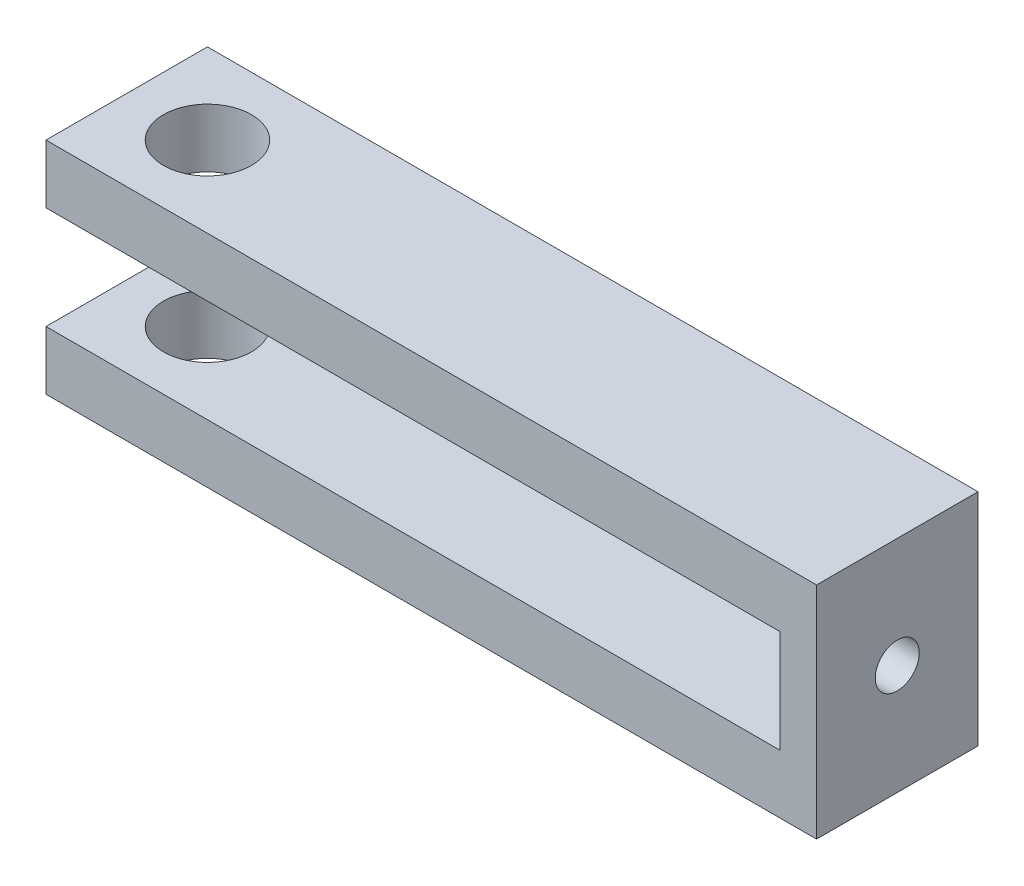
ISO-10303-21;
HEADER;
FILE_DESCRIPTION(('STEP AP214'),'2;1');
FILE_NAME('part.step','',(''),(''),'','','');
FILE_SCHEMA(('AUTOMOTIVE_DESIGN { 1 0 10303 214 1 1 1 1 }'));
ENDSEC;
DATA;
#1=APPLICATION_CONTEXT('core data for automotive mechanical design processes');
#2=APPLICATION_PROTOCOL_DEFINITION('international standard','automotive_design',2000,#1);
#3=PRODUCT_CONTEXT('',#1,'mechanical');
#4=PRODUCT('Part','Part','',(#3));
#5=PRODUCT_RELATED_PRODUCT_CATEGORY('part','',(#4));
#6=PRODUCT_DEFINITION_FORMATION('','',#4);
#7=PRODUCT_DEFINITION_CONTEXT('part definition',#1,'design');
#8=PRODUCT_DEFINITION('design','',#6,#7);
#9=PRODUCT_DEFINITION_SHAPE('','',#8);
#10=(LENGTH_UNIT() NAMED_UNIT(*) SI_UNIT(.MILLI.,.METRE.));
#11=(NAMED_UNIT(*) PLANE_ANGLE_UNIT() SI_UNIT($,.RADIAN.));
#12=(NAMED_UNIT(*) SI_UNIT($,.STERADIAN.) SOLID_ANGLE_UNIT());
#13=UNCERTAINTY_MEASURE_WITH_UNIT(LENGTH_MEASURE(1.E-05),#10,'distance_accuracy_value','');
#14=(GEOMETRIC_REPRESENTATION_CONTEXT(3) GLOBAL_UNCERTAINTY_ASSIGNED_CONTEXT((#13)) GLOBAL_UNIT_ASSIGNED_CONTEXT((#10,
#11,#12)) REPRESENTATION_CONTEXT('',''));
#15=CARTESIAN_POINT('',(0.,0.,0.));
#16=DIRECTION('',(0.,0.,1.));
#17=DIRECTION('',(1.,0.,0.));
#18=AXIS2_PLACEMENT_3D('',#15,#16,#17);
#19=CARTESIAN_POINT('',(0.,15.,22.));
#20=DIRECTION('',(0.,-1.,0.));
#21=DIRECTION('',(1.,0.,0.));
#22=AXIS2_PLACEMENT_3D('',#19,#20,#21);
#23=PLANE('',#22);
#24=CARTESIAN_POINT('',(-94.,15.,11.));
#25=DIRECTION('',(0.,-1.,0.));
#26=DIRECTION('',(0.,0.,-1.));
#27=AXIS2_PLACEMENT_3D('',#24,#25,#26);
#28=CIRCLE('',#27,6.);
#29=CARTESIAN_POINT('',(-94.,15.,5.));
#30=VERTEX_POINT('',#29);
#31=EDGE_CURVE('E183',#30,#30,#28,.T.);
#32=ORIENTED_EDGE('',*,*,#31,.T.);
#33=EDGE_LOOP('',(#32));
#34=FACE_BOUND('',#33,.T.);
#35=DIRECTION('',(-1.,0.,0.));
#36=VECTOR('',#35,1.);
#37=CARTESIAN_POINT('',(0.,15.,0.));
#38=LINE('',#37,#36);
#39=CARTESIAN_POINT('',(0.,15.,0.));
#40=VERTEX_POINT('',#39);
#41=CARTESIAN_POINT('',(-105.,15.,0.));
#42=VERTEX_POINT('',#41);
#43=EDGE_CURVE('E130',#40,#42,#38,.T.);
#44=ORIENTED_EDGE('',*,*,#43,.T.);
#45=DIRECTION('',(0.,0.,-1.));
#46=VECTOR('',#45,1.);
#47=CARTESIAN_POINT('',(-105.,15.,22.));
#48=LINE('',#47,#46);
#49=CARTESIAN_POINT('',(-105.,15.,22.));
#50=VERTEX_POINT('',#49);
#51=EDGE_CURVE('E11',#50,#42,#48,.T.);
#52=ORIENTED_EDGE('',*,*,#51,.F.);
#53=DIRECTION('',(-1.,0.,0.));
#54=VECTOR('',#53,1.);
#55=CARTESIAN_POINT('',(0.,15.,22.));
#56=LINE('',#55,#54);
#57=CARTESIAN_POINT('',(0.,15.,22.));
#58=VERTEX_POINT('',#57);
#59=EDGE_CURVE('E145',#58,#50,#56,.T.);
#60=ORIENTED_EDGE('',*,*,#59,.F.);
#61=DIRECTION('',(0.,0.,-1.));
#62=VECTOR('',#61,1.);
#63=CARTESIAN_POINT('',(0.,15.,22.));
#64=LINE('',#63,#62);
#65=EDGE_CURVE('E126',#58,#40,#64,.T.);
#66=ORIENTED_EDGE('',*,*,#65,.T.);
#67=EDGE_LOOP('',(#44,#52,#60,#66));
#68=FACE_BOUND('',#67,.T.);
#69=ADVANCED_FACE('F34',(#34,#68),#23,.F.);
#70=CARTESIAN_POINT('',(-105.,15.,22.));
#71=DIRECTION('',(1.,0.,0.));
#72=DIRECTION('',(0.,0.,-1.));
#73=AXIS2_PLACEMENT_3D('',#70,#71,#72);
#74=PLANE('',#73);
#75=DIRECTION('',(0.,-1.,0.));
#76=VECTOR('',#75,1.);
#77=CARTESIAN_POINT('',(-105.,15.,0.));
#78=LINE('',#77,#76);
#79=CARTESIAN_POINT('',(-105.,7.00000000000002,0.));
#80=VERTEX_POINT('',#79);
#81=EDGE_CURVE('E133',#42,#80,#78,.T.);
#82=ORIENTED_EDGE('',*,*,#81,.T.);
#83=DIRECTION('',(0.,0.,-1.));
#84=VECTOR('',#83,1.);
#85=CARTESIAN_POINT('',(-105.,7.00000000000002,22.));
#86=LINE('',#85,#84);
#87=CARTESIAN_POINT('',(-105.,7.00000000000002,22.));
#88=VERTEX_POINT('',#87);
#89=EDGE_CURVE('E42',#88,#80,#86,.T.);
#90=ORIENTED_EDGE('',*,*,#89,.F.);
#91=DIRECTION('',(0.,-1.,0.));
#92=VECTOR('',#91,1.);
#93=CARTESIAN_POINT('',(-105.,15.,22.));
#94=LINE('',#93,#92);
#95=EDGE_CURVE('E93',#50,#88,#94,.T.);
#96=ORIENTED_EDGE('',*,*,#95,.F.);
#97=ORIENTED_EDGE('',*,*,#51,.T.);
#98=EDGE_LOOP('',(#82,#90,#96,#97));
#99=FACE_BOUND('',#98,.T.);
#100=ADVANCED_FACE('F211',(#99),#74,.F.);
#101=CARTESIAN_POINT('',(-105.,7.00000000000002,22.));
#102=DIRECTION('',(0.,1.,0.));
#103=DIRECTION('',(-1.,0.,0.));
#104=AXIS2_PLACEMENT_3D('',#101,#102,#103);
#105=PLANE('',#104);
#106=CARTESIAN_POINT('',(-94.,7.00000000000001,11.));
#107=DIRECTION('',(0.,1.,0.));
#108=DIRECTION('',(-1.,0.,0.));
#109=AXIS2_PLACEMENT_3D('',#106,#107,#108);
#110=CIRCLE('',#109,6.);
#111=CARTESIAN_POINT('',(-100.,7.00000000000001,11.));
#112=VERTEX_POINT('',#111);
#113=EDGE_CURVE('E134',#112,#112,#110,.T.);
#114=ORIENTED_EDGE('',*,*,#113,.T.);
#115=EDGE_LOOP('',(#114));
#116=FACE_BOUND('',#115,.T.);
#117=DIRECTION('',(1.,0.,0.));
#118=VECTOR('',#117,1.);
#119=CARTESIAN_POINT('',(-105.,7.00000000000002,0.));
#120=LINE('',#119,#118);
#121=CARTESIAN_POINT('',(-4.99999999999999,7.,0.));
#122=VERTEX_POINT('',#121);
#123=EDGE_CURVE('E136',#80,#122,#120,.T.);
#124=ORIENTED_EDGE('',*,*,#123,.T.);
#125=DIRECTION('',(0.,0.,-1.));
#126=VECTOR('',#125,1.);
#127=CARTESIAN_POINT('',(-4.99999999999999,7.,22.));
#128=LINE('',#127,#126);
#129=CARTESIAN_POINT('',(-4.99999999999999,7.,22.));
#130=VERTEX_POINT('',#129);
#131=EDGE_CURVE('E152',#130,#122,#128,.T.);
#132=ORIENTED_EDGE('',*,*,#131,.F.);
#133=DIRECTION('',(1.,0.,0.));
#134=VECTOR('',#133,1.);
#135=CARTESIAN_POINT('',(-105.,7.00000000000002,22.));
#136=LINE('',#135,#134);
#137=EDGE_CURVE('E160',#88,#130,#136,.T.);
#138=ORIENTED_EDGE('',*,*,#137,.F.);
#139=ORIENTED_EDGE('',*,*,#89,.T.);
#140=EDGE_LOOP('',(#124,#132,#138,#139));
#141=FACE_BOUND('',#140,.T.);
#142=ADVANCED_FACE('F158',(#116,#141),#105,.F.);
#143=CARTESIAN_POINT('',(-4.99999999999999,7.,22.));
#144=DIRECTION('',(1.,0.,0.));
#145=DIRECTION('',(0.,1.,0.));
#146=AXIS2_PLACEMENT_3D('',#143,#144,#145);
#147=PLANE('',#146);
#148=CARTESIAN_POINT('',(-4.99999999999999,0.,11.));
#149=DIRECTION('',(1.,0.,0.));
#150=DIRECTION('',(0.,1.,0.));
#151=AXIS2_PLACEMENT_3D('',#148,#149,#150);
#152=CIRCLE('',#151,3.);
#153=CARTESIAN_POINT('',(-4.99999999999999,3.,11.));
#154=VERTEX_POINT('',#153);
#155=EDGE_CURVE('E187',#154,#154,#152,.T.);
#156=ORIENTED_EDGE('',*,*,#155,.T.);
#157=EDGE_LOOP('',(#156));
#158=FACE_BOUND('',#157,.T.);
#159=DIRECTION('',(0.,-1.,0.));
#160=VECTOR('',#159,1.);
#161=CARTESIAN_POINT('',(-4.99999999999999,7.,0.));
#162=LINE('',#161,#160);
#163=CARTESIAN_POINT('',(-4.99999999999999,-7.,0.));
#164=VERTEX_POINT('',#163);
#165=EDGE_CURVE('E138',#122,#164,#162,.T.);
#166=ORIENTED_EDGE('',*,*,#165,.T.);
#167=DIRECTION('',(0.,0.,-1.));
#168=VECTOR('',#167,1.);
#169=CARTESIAN_POINT('',(-4.99999999999999,-7.,22.));
#170=LINE('',#169,#168);
#171=CARTESIAN_POINT('',(-4.99999999999999,-7.,22.));
#172=VERTEX_POINT('',#171);
#173=EDGE_CURVE('E149',#172,#164,#170,.T.);
#174=ORIENTED_EDGE('',*,*,#173,.F.);
#175=DIRECTION('',(0.,-1.,0.));
#176=VECTOR('',#175,1.);
#177=CARTESIAN_POINT('',(-4.99999999999999,7.,22.));
#178=LINE('',#177,#176);
#179=EDGE_CURVE('E172',#130,#172,#178,.T.);
#180=ORIENTED_EDGE('',*,*,#179,.F.);
#181=ORIENTED_EDGE('',*,*,#131,.T.);
#182=EDGE_LOOP('',(#166,#174,#180,#181));
#183=FACE_BOUND('',#182,.T.);
#184=ADVANCED_FACE('F168',(#158,#183),#147,.F.);
#185=CARTESIAN_POINT('',(-4.99999999999999,-7.,22.));
#186=DIRECTION('',(0.,-1.,0.));
#187=DIRECTION('',(1.,0.,0.));
#188=AXIS2_PLACEMENT_3D('',#185,#186,#187);
#189=PLANE('',#188);
#190=CARTESIAN_POINT('',(-94.,-7.00000000000001,11.));
#191=DIRECTION('',(0.,-1.,0.));
#192=DIRECTION('',(1.,0.,0.));
#193=AXIS2_PLACEMENT_3D('',#190,#191,#192);
#194=CIRCLE('',#193,6.);
#195=CARTESIAN_POINT('',(-88.,-7.00000000000001,11.));
#196=VERTEX_POINT('',#195);
#197=EDGE_CURVE('E180',#196,#196,#194,.T.);
#198=ORIENTED_EDGE('',*,*,#197,.T.);
#199=EDGE_LOOP('',(#198));
#200=FACE_BOUND('',#199,.T.);
#201=DIRECTION('',(-1.,0.,0.));
#202=VECTOR('',#201,1.);
#203=CARTESIAN_POINT('',(-4.99999999999999,-7.,0.));
#204=LINE('',#203,#202);
#205=CARTESIAN_POINT('',(-105.,-7.00000000000001,0.));
#206=VERTEX_POINT('',#205);
#207=EDGE_CURVE('E140',#164,#206,#204,.T.);
#208=ORIENTED_EDGE('',*,*,#207,.T.);
#209=DIRECTION('',(0.,0.,-1.));
#210=VECTOR('',#209,1.);
#211=CARTESIAN_POINT('',(-105.,-7.00000000000001,22.));
#212=LINE('',#211,#210);
#213=CARTESIAN_POINT('',(-105.,-7.00000000000001,22.));
#214=VERTEX_POINT('',#213);
#215=EDGE_CURVE('E121',#214,#206,#212,.T.);
#216=ORIENTED_EDGE('',*,*,#215,.F.);
#217=DIRECTION('',(-1.,0.,0.));
#218=VECTOR('',#217,1.);
#219=CARTESIAN_POINT('',(-4.99999999999999,-7.,22.));
#220=LINE('',#219,#218);
#221=EDGE_CURVE('E112',#172,#214,#220,.T.);
#222=ORIENTED_EDGE('',*,*,#221,.F.);
#223=ORIENTED_EDGE('',*,*,#173,.T.);
#224=EDGE_LOOP('',(#208,#216,#222,#223));
#225=FACE_BOUND('',#224,.T.);
#226=ADVANCED_FACE('F171',(#200,#225),#189,.F.);
#227=CARTESIAN_POINT('',(-105.,-7.00000000000001,22.));
#228=DIRECTION('',(1.,0.,0.));
#229=DIRECTION('',(0.,0.,-1.));
#230=AXIS2_PLACEMENT_3D('',#227,#228,#229);
#231=PLANE('',#230);
#232=DIRECTION('',(0.,-1.,0.));
#233=VECTOR('',#232,1.);
#234=CARTESIAN_POINT('',(-105.,-7.00000000000001,0.));
#235=LINE('',#234,#233);
#236=CARTESIAN_POINT('',(-105.,-15.,0.));
#237=VERTEX_POINT('',#236);
#238=EDGE_CURVE('E120',#206,#237,#235,.T.);
#239=ORIENTED_EDGE('',*,*,#238,.T.);
#240=DIRECTION('',(0.,0.,-1.));
#241=VECTOR('',#240,1.);
#242=CARTESIAN_POINT('',(-105.,-15.,22.));
#243=LINE('',#242,#241);
#244=CARTESIAN_POINT('',(-105.,-15.,22.));
#245=VERTEX_POINT('',#244);
#246=EDGE_CURVE('E117',#245,#237,#243,.T.);
#247=ORIENTED_EDGE('',*,*,#246,.F.);
#248=DIRECTION('',(0.,-1.,0.));
#249=VECTOR('',#248,1.);
#250=CARTESIAN_POINT('',(-105.,-7.00000000000001,22.));
#251=LINE('',#250,#249);
#252=EDGE_CURVE('E106',#214,#245,#251,.T.);
#253=ORIENTED_EDGE('',*,*,#252,.F.);
#254=ORIENTED_EDGE('',*,*,#215,.T.);
#255=EDGE_LOOP('',(#239,#247,#253,#254));
#256=FACE_BOUND('',#255,.T.);
#257=ADVANCED_FACE('F118',(#256),#231,.F.);
#258=CARTESIAN_POINT('',(-105.,-15.,22.));
#259=DIRECTION('',(0.,1.,0.));
#260=DIRECTION('',(-1.,0.,0.));
#261=AXIS2_PLACEMENT_3D('',#258,#259,#260);
#262=PLANE('',#261);
#263=CARTESIAN_POINT('',(-94.,-15.,11.));
#264=DIRECTION('',(0.,-1.,0.));
#265=DIRECTION('',(0.,0.,-1.));
#266=AXIS2_PLACEMENT_3D('',#263,#264,#265);
#267=CIRCLE('',#266,6.);
#268=CARTESIAN_POINT('',(-94.,-15.,5.));
#269=VERTEX_POINT('',#268);
#270=EDGE_CURVE('E184',#269,#269,#267,.T.);
#271=ORIENTED_EDGE('',*,*,#270,.F.);
#272=EDGE_LOOP('',(#271));
#273=FACE_BOUND('',#272,.T.);
#274=DIRECTION('',(1.,0.,0.));
#275=VECTOR('',#274,1.);
#276=CARTESIAN_POINT('',(-105.,-15.,0.));
#277=LINE('',#276,#275);
#278=CARTESIAN_POINT('',(0.,-15.,0.));
#279=VERTEX_POINT('',#278);
#280=EDGE_CURVE('E79',#237,#279,#277,.T.);
#281=ORIENTED_EDGE('',*,*,#280,.T.);
#282=DIRECTION('',(0.,0.,-1.));
#283=VECTOR('',#282,1.);
#284=CARTESIAN_POINT('',(0.,-15.,22.));
#285=LINE('',#284,#283);
#286=CARTESIAN_POINT('',(0.,-15.,22.));
#287=VERTEX_POINT('',#286);
#288=EDGE_CURVE('E122',#287,#279,#285,.T.);
#289=ORIENTED_EDGE('',*,*,#288,.F.);
#290=DIRECTION('',(1.,0.,0.));
#291=VECTOR('',#290,1.);
#292=CARTESIAN_POINT('',(-105.,-15.,22.));
#293=LINE('',#292,#291);
#294=EDGE_CURVE('E110',#245,#287,#293,.T.);
#295=ORIENTED_EDGE('',*,*,#294,.F.);
#296=ORIENTED_EDGE('',*,*,#246,.T.);
#297=EDGE_LOOP('',(#281,#289,#295,#296));
#298=FACE_BOUND('',#297,.T.);
#299=ADVANCED_FACE('F124',(#273,#298),#262,.F.);
#300=CARTESIAN_POINT('',(0.,-15.,22.));
#301=DIRECTION('',(-1.,0.,0.));
#302=DIRECTION('',(0.,-1.,0.));
#303=AXIS2_PLACEMENT_3D('',#300,#301,#302);
#304=PLANE('',#303);
#305=CARTESIAN_POINT('',(0.,0.,11.));
#306=DIRECTION('',(1.,0.,0.));
#307=DIRECTION('',(0.,1.,0.));
#308=AXIS2_PLACEMENT_3D('',#305,#306,#307);
#309=CIRCLE('',#308,3.);
#310=CARTESIAN_POINT('',(0.,3.,11.));
#311=VERTEX_POINT('',#310);
#312=EDGE_CURVE('E192',#311,#311,#309,.T.);
#313=ORIENTED_EDGE('',*,*,#312,.F.);
#314=EDGE_LOOP('',(#313));
#315=FACE_BOUND('',#314,.T.);
#316=DIRECTION('',(0.,1.,0.));
#317=VECTOR('',#316,1.);
#318=CARTESIAN_POINT('',(0.,-15.,0.));
#319=LINE('',#318,#317);
#320=EDGE_CURVE('E85',#279,#40,#319,.T.);
#321=ORIENTED_EDGE('',*,*,#320,.T.);
#322=ORIENTED_EDGE('',*,*,#65,.F.);
#323=DIRECTION('',(0.,1.,0.));
#324=VECTOR('',#323,1.);
#325=CARTESIAN_POINT('',(0.,-15.,22.));
#326=LINE('',#325,#324);
#327=EDGE_CURVE('E50',#287,#58,#326,.T.);
#328=ORIENTED_EDGE('',*,*,#327,.F.);
#329=ORIENTED_EDGE('',*,*,#288,.T.);
#330=EDGE_LOOP('',(#321,#322,#328,#329));
#331=FACE_BOUND('',#330,.T.);
#332=ADVANCED_FACE('F199',(#315,#331),#304,.F.);
#333=CARTESIAN_POINT('',(0.,0.,22.));
#334=DIRECTION('',(0.,0.,1.));
#335=DIRECTION('',(1.,0.,0.));
#336=AXIS2_PLACEMENT_3D('',#333,#334,#335);
#337=PLANE('',#336);
#338=ORIENTED_EDGE('',*,*,#59,.T.);
#339=ORIENTED_EDGE('',*,*,#95,.T.);
#340=ORIENTED_EDGE('',*,*,#137,.T.);
#341=ORIENTED_EDGE('',*,*,#179,.T.);
#342=ORIENTED_EDGE('',*,*,#221,.T.);
#343=ORIENTED_EDGE('',*,*,#252,.T.);
#344=ORIENTED_EDGE('',*,*,#294,.T.);
#345=ORIENTED_EDGE('',*,*,#327,.T.);
#346=EDGE_LOOP('',(#338,#339,#340,#341,#342,#343,#344,#345));
#347=FACE_BOUND('',#346,.T.);
#348=ADVANCED_FACE('F108',(#347),#337,.T.);
#349=CARTESIAN_POINT('',(0.,0.,0.));
#350=DIRECTION('',(0.,0.,1.));
#351=DIRECTION('',(1.,0.,0.));
#352=AXIS2_PLACEMENT_3D('',#349,#350,#351);
#353=PLANE('',#352);
#354=ORIENTED_EDGE('',*,*,#43,.F.);
#355=ORIENTED_EDGE('',*,*,#320,.F.);
#356=ORIENTED_EDGE('',*,*,#280,.F.);
#357=ORIENTED_EDGE('',*,*,#238,.F.);
#358=ORIENTED_EDGE('',*,*,#207,.F.);
#359=ORIENTED_EDGE('',*,*,#165,.F.);
#360=ORIENTED_EDGE('',*,*,#123,.F.);
#361=ORIENTED_EDGE('',*,*,#81,.F.);
#362=EDGE_LOOP('',(#354,#355,#356,#357,#358,#359,#360,#361));
#363=FACE_BOUND('',#362,.T.);
#364=ADVANCED_FACE('F164',(#363),#353,.F.);
#365=CARTESIAN_POINT('',(-94.,15.,11.));
#366=DIRECTION('',(0.,-1.,0.));
#367=DIRECTION('',(0.,0.,-1.));
#368=AXIS2_PLACEMENT_3D('',#365,#366,#367);
#369=CYLINDRICAL_SURFACE('',#368,6.);
#370=ORIENTED_EDGE('',*,*,#270,.T.);
#371=EDGE_LOOP('',(#370));
#372=FACE_BOUND('',#371,.T.);
#373=ORIENTED_EDGE('',*,*,#197,.F.);
#374=EDGE_LOOP('',(#373));
#375=FACE_BOUND('',#374,.T.);
#376=ADVANCED_FACE('F224',(#372,#375),#369,.F.);
#377=ORIENTED_EDGE('',*,*,#31,.F.);
#378=EDGE_LOOP('',(#377));
#379=FACE_BOUND('',#378,.T.);
#380=ORIENTED_EDGE('',*,*,#113,.F.);
#381=EDGE_LOOP('',(#380));
#382=FACE_BOUND('',#381,.T.);
#383=ADVANCED_FACE('F221',(#379,#382),#369,.F.);
#384=CARTESIAN_POINT('',(-105.,0.,11.));
#385=DIRECTION('',(1.,0.,0.));
#386=DIRECTION('',(0.,1.,0.));
#387=AXIS2_PLACEMENT_3D('',#384,#385,#386);
#388=CYLINDRICAL_SURFACE('',#387,3.);
#389=ORIENTED_EDGE('',*,*,#312,.T.);
#390=EDGE_LOOP('',(#389));
#391=FACE_BOUND('',#390,.T.);
#392=ORIENTED_EDGE('',*,*,#155,.F.);
#393=EDGE_LOOP('',(#392));
#394=FACE_BOUND('',#393,.T.);
#395=ADVANCED_FACE('F196',(#391,#394),#388,.F.);
#396=CLOSED_SHELL('',(#69,#100,#142,#184,#226,#257,#299,#332,#348,#364,#376,#383,#395));
#397=MANIFOLD_SOLID_BREP('B2',#396);
#398=ADVANCED_BREP_SHAPE_REPRESENTATION('',(#18,#397),#14);
#399=SHAPE_DEFINITION_REPRESENTATION(#9,#398);
ENDSEC;
END-ISO-10303-21;
